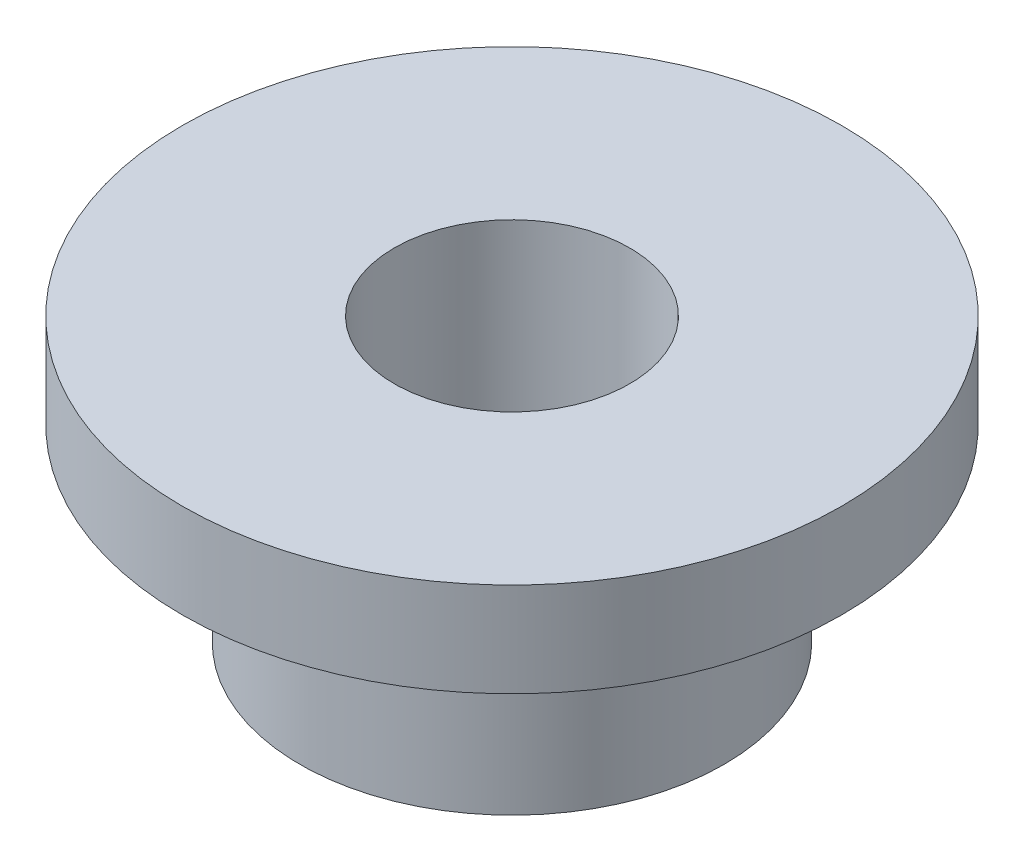
ISO-10303-21;
HEADER;
FILE_DESCRIPTION(('STEP AP214'),'2;1');
FILE_NAME('part.step','',(''),(''),'','','');
FILE_SCHEMA(('AUTOMOTIVE_DESIGN { 1 0 10303 214 1 1 1 1 }'));
ENDSEC;
DATA;
#1=APPLICATION_CONTEXT('core data for automotive mechanical design processes');
#2=APPLICATION_PROTOCOL_DEFINITION('international standard','automotive_design',2000,#1);
#3=PRODUCT_CONTEXT('',#1,'mechanical');
#4=PRODUCT('Part','Part','',(#3));
#5=PRODUCT_RELATED_PRODUCT_CATEGORY('part','',(#4));
#6=PRODUCT_DEFINITION_FORMATION('','',#4);
#7=PRODUCT_DEFINITION_CONTEXT('part definition',#1,'design');
#8=PRODUCT_DEFINITION('design','',#6,#7);
#9=PRODUCT_DEFINITION_SHAPE('','',#8);
#10=(LENGTH_UNIT() NAMED_UNIT(*) SI_UNIT(.MILLI.,.METRE.));
#11=(NAMED_UNIT(*) PLANE_ANGLE_UNIT() SI_UNIT($,.RADIAN.));
#12=(NAMED_UNIT(*) SI_UNIT($,.STERADIAN.) SOLID_ANGLE_UNIT());
#13=UNCERTAINTY_MEASURE_WITH_UNIT(LENGTH_MEASURE(1.E-05),#10,'distance_accuracy_value','');
#14=(GEOMETRIC_REPRESENTATION_CONTEXT(3) GLOBAL_UNCERTAINTY_ASSIGNED_CONTEXT((#13)) GLOBAL_UNIT_ASSIGNED_CONTEXT((#10,
#11,#12)) REPRESENTATION_CONTEXT('',''));
#15=CARTESIAN_POINT('',(0.,0.,0.));
#16=DIRECTION('',(0.,0.,1.));
#17=DIRECTION('',(1.,0.,0.));
#18=AXIS2_PLACEMENT_3D('',#15,#16,#17);
#19=CARTESIAN_POINT('',(-10.,2.69645807313304,0.));
#20=DIRECTION('',(0.,1.,0.));
#21=DIRECTION('',(-1.,0.,0.));
#22=AXIS2_PLACEMENT_3D('',#19,#20,#21);
#23=CYLINDRICAL_SURFACE('',#22,10.);
#24=CARTESIAN_POINT('',(-10.,-24.,0.));
#25=DIRECTION('',(0.,1.,0.));
#26=DIRECTION('',(-1.,0.,0.));
#27=AXIS2_PLACEMENT_3D('',#24,#25,#26);
#28=CIRCLE('',#27,10.);
#29=CARTESIAN_POINT('',(-20.,-24.,0.));
#30=VERTEX_POINT('',#29);
#31=EDGE_CURVE('E68',#30,#30,#28,.T.);
#32=ORIENTED_EDGE('',*,*,#31,.F.);
#33=EDGE_LOOP('',(#32));
#34=FACE_BOUND('',#33,.T.);
#35=CARTESIAN_POINT('',(-10.,0.,0.));
#36=DIRECTION('',(0.,1.,0.));
#37=DIRECTION('',(-1.,0.,0.));
#38=AXIS2_PLACEMENT_3D('',#35,#36,#37);
#39=CIRCLE('',#38,10.);
#40=CARTESIAN_POINT('',(-20.,0.,0.));
#41=VERTEX_POINT('',#40);
#42=EDGE_CURVE('E10',#41,#41,#39,.T.);
#43=ORIENTED_EDGE('',*,*,#42,.T.);
#44=EDGE_LOOP('',(#43));
#45=FACE_BOUND('',#44,.T.);
#46=ADVANCED_FACE('F41',(#34,#45),#23,.F.);
#47=CARTESIAN_POINT('',(0.,0.,0.));
#48=DIRECTION('',(0.,-1.,0.));
#49=DIRECTION('',(1.,0.,0.));
#50=AXIS2_PLACEMENT_3D('',#47,#48,#49);
#51=PLANE('',#50);
#52=ORIENTED_EDGE('',*,*,#42,.F.);
#53=EDGE_LOOP('',(#52));
#54=FACE_BOUND('',#53,.T.);
#55=CARTESIAN_POINT('',(-10.,0.,0.));
#56=DIRECTION('',(0.,1.,0.));
#57=DIRECTION('',(-1.,0.,0.));
#58=AXIS2_PLACEMENT_3D('',#55,#56,#57);
#59=CIRCLE('',#58,28.);
#60=CARTESIAN_POINT('',(-38.,0.,0.));
#61=VERTEX_POINT('',#60);
#62=EDGE_CURVE('E48',#61,#61,#59,.T.);
#63=ORIENTED_EDGE('',*,*,#62,.T.);
#64=EDGE_LOOP('',(#63));
#65=FACE_BOUND('',#64,.T.);
#66=ADVANCED_FACE('F76',(#54,#65),#51,.F.);
#67=CARTESIAN_POINT('',(-10.,2.69645807313304,0.));
#68=DIRECTION('',(0.,1.,0.));
#69=DIRECTION('',(-1.,0.,0.));
#70=AXIS2_PLACEMENT_3D('',#67,#68,#69);
#71=CYLINDRICAL_SURFACE('',#70,28.);
#72=ORIENTED_EDGE('',*,*,#62,.F.);
#73=EDGE_LOOP('',(#72));
#74=FACE_BOUND('',#73,.T.);
#75=CARTESIAN_POINT('',(-10.,-8.,0.));
#76=DIRECTION('',(0.,1.,0.));
#77=DIRECTION('',(-1.,0.,0.));
#78=AXIS2_PLACEMENT_3D('',#75,#76,#77);
#79=CIRCLE('',#78,28.);
#80=CARTESIAN_POINT('',(-38.,-8.00000000000001,0.));
#81=VERTEX_POINT('',#80);
#82=EDGE_CURVE('E53',#81,#81,#79,.T.);
#83=ORIENTED_EDGE('',*,*,#82,.T.);
#84=EDGE_LOOP('',(#83));
#85=FACE_BOUND('',#84,.T.);
#86=ADVANCED_FACE('F80',(#74,#85),#71,.T.);
#87=CARTESIAN_POINT('',(18.,-8.,0.));
#88=DIRECTION('',(0.,1.,0.));
#89=DIRECTION('',(-1.,0.,0.));
#90=AXIS2_PLACEMENT_3D('',#87,#88,#89);
#91=PLANE('',#90);
#92=ORIENTED_EDGE('',*,*,#82,.F.);
#93=EDGE_LOOP('',(#92));
#94=FACE_BOUND('',#93,.T.);
#95=CARTESIAN_POINT('',(-10.,-8.,0.));
#96=DIRECTION('',(0.,1.,0.));
#97=DIRECTION('',(-1.,0.,0.));
#98=AXIS2_PLACEMENT_3D('',#95,#96,#97);
#99=CIRCLE('',#98,18.);
#100=CARTESIAN_POINT('',(-28.,-8.00000000000001,0.));
#101=VERTEX_POINT('',#100);
#102=EDGE_CURVE('E58',#101,#101,#99,.T.);
#103=ORIENTED_EDGE('',*,*,#102,.T.);
#104=EDGE_LOOP('',(#103));
#105=FACE_BOUND('',#104,.T.);
#106=ADVANCED_FACE('F85',(#94,#105),#91,.F.);
#107=CARTESIAN_POINT('',(-10.,2.69645807313304,0.));
#108=DIRECTION('',(0.,1.,0.));
#109=DIRECTION('',(-1.,0.,0.));
#110=AXIS2_PLACEMENT_3D('',#107,#108,#109);
#111=CYLINDRICAL_SURFACE('',#110,18.);
#112=ORIENTED_EDGE('',*,*,#102,.F.);
#113=EDGE_LOOP('',(#112));
#114=FACE_BOUND('',#113,.T.);
#115=CARTESIAN_POINT('',(-10.,-24.,0.));
#116=DIRECTION('',(0.,1.,0.));
#117=DIRECTION('',(-1.,0.,0.));
#118=AXIS2_PLACEMENT_3D('',#115,#116,#117);
#119=CIRCLE('',#118,18.);
#120=CARTESIAN_POINT('',(-28.,-24.,0.));
#121=VERTEX_POINT('',#120);
#122=EDGE_CURVE('E64',#121,#121,#119,.T.);
#123=ORIENTED_EDGE('',*,*,#122,.T.);
#124=EDGE_LOOP('',(#123));
#125=FACE_BOUND('',#124,.T.);
#126=ADVANCED_FACE('F91',(#114,#125),#111,.T.);
#127=CARTESIAN_POINT('',(8.,-24.,0.));
#128=DIRECTION('',(0.,1.,0.));
#129=DIRECTION('',(-1.,0.,0.));
#130=AXIS2_PLACEMENT_3D('',#127,#128,#129);
#131=PLANE('',#130);
#132=ORIENTED_EDGE('',*,*,#122,.F.);
#133=EDGE_LOOP('',(#132));
#134=FACE_BOUND('',#133,.T.);
#135=ORIENTED_EDGE('',*,*,#31,.T.);
#136=EDGE_LOOP('',(#135));
#137=FACE_BOUND('',#136,.T.);
#138=ADVANCED_FACE('F73',(#134,#137),#131,.F.);
#139=CLOSED_SHELL('',(#46,#66,#86,#106,#126,#138));
#140=MANIFOLD_SOLID_BREP('B2',#139);
#141=ADVANCED_BREP_SHAPE_REPRESENTATION('',(#18,#140),#14);
#142=SHAPE_DEFINITION_REPRESENTATION(#9,#141);
ENDSEC;
END-ISO-10303-21;
